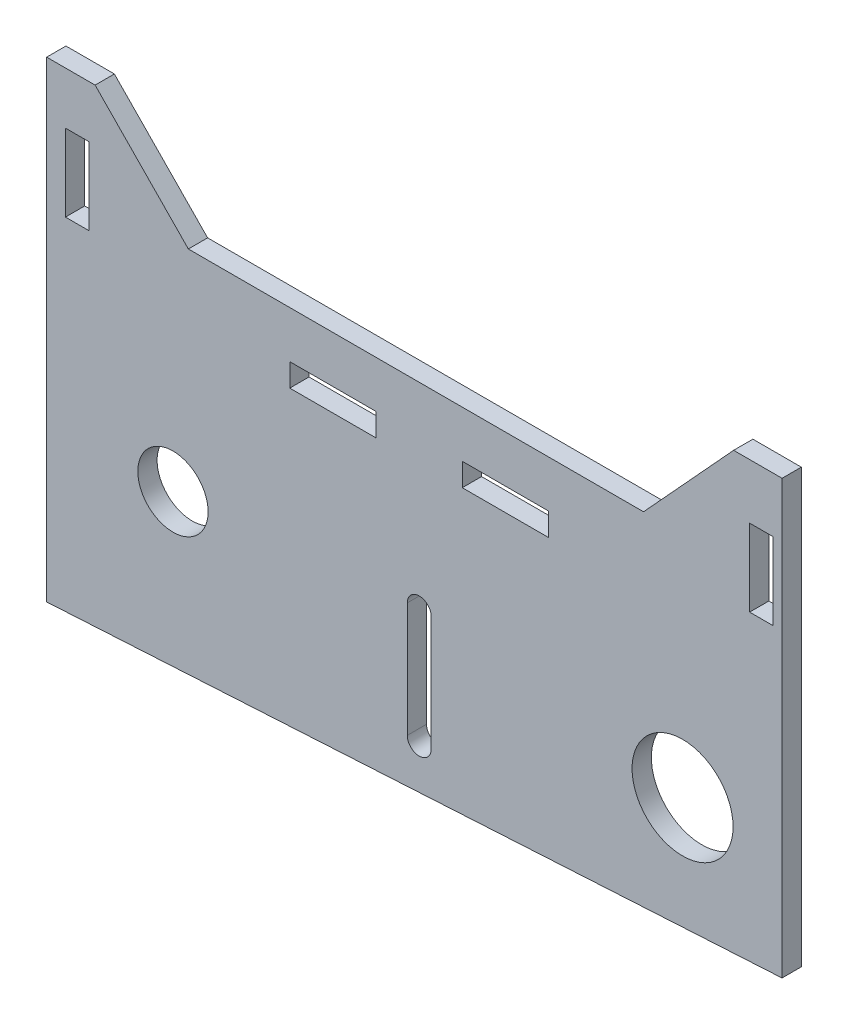
ISO-10303-21;
HEADER;
FILE_DESCRIPTION(('STEP AP214'),'2;1');
FILE_NAME('part.step','',(''),(''),'','','');
FILE_SCHEMA(('AUTOMOTIVE_DESIGN { 1 0 10303 214 1 1 1 1 }'));
ENDSEC;
DATA;
#1=APPLICATION_CONTEXT('core data for automotive mechanical design processes');
#2=APPLICATION_PROTOCOL_DEFINITION('international standard','automotive_design',2000,#1);
#3=PRODUCT_CONTEXT('',#1,'mechanical');
#4=PRODUCT('Part','Part','',(#3));
#5=PRODUCT_RELATED_PRODUCT_CATEGORY('part','',(#4));
#6=PRODUCT_DEFINITION_FORMATION('','',#4);
#7=PRODUCT_DEFINITION_CONTEXT('part definition',#1,'design');
#8=PRODUCT_DEFINITION('design','',#6,#7);
#9=PRODUCT_DEFINITION_SHAPE('','',#8);
#10=(LENGTH_UNIT() NAMED_UNIT(*) SI_UNIT(.MILLI.,.METRE.));
#11=(NAMED_UNIT(*) PLANE_ANGLE_UNIT() SI_UNIT($,.RADIAN.));
#12=(NAMED_UNIT(*) SI_UNIT($,.STERADIAN.) SOLID_ANGLE_UNIT());
#13=UNCERTAINTY_MEASURE_WITH_UNIT(LENGTH_MEASURE(1.E-05),#10,'distance_accuracy_value','');
#14=(GEOMETRIC_REPRESENTATION_CONTEXT(3) GLOBAL_UNCERTAINTY_ASSIGNED_CONTEXT((#13)) GLOBAL_UNIT_ASSIGNED_CONTEXT((#10,
#11,#12)) REPRESENTATION_CONTEXT('',''));
#15=CARTESIAN_POINT('',(0.,0.,0.));
#16=DIRECTION('',(0.,0.,1.));
#17=DIRECTION('',(1.,0.,0.));
#18=AXIS2_PLACEMENT_3D('',#15,#16,#17);
#19=CARTESIAN_POINT('',(0.,0.,3.7));
#20=DIRECTION('',(0.,0.,-1.));
#21=DIRECTION('',(-1.,0.,0.));
#22=AXIS2_PLACEMENT_3D('',#19,#20,#21);
#23=PLANE('',#22);
#24=DIRECTION('',(0.,-1.,0.));
#25=VECTOR('',#24,1.);
#26=CARTESIAN_POINT('',(-19.7334198475014,21.4267015706806,3.7));
#27=LINE('',#26,#25);
#28=CARTESIAN_POINT('',(-19.7334198475014,25.8267015706806,3.7));
#29=VERTEX_POINT('',#28);
#30=CARTESIAN_POINT('',(-19.7334198475014,21.4267015706806,3.7));
#31=VERTEX_POINT('',#30);
#32=EDGE_CURVE('E261',#29,#31,#27,.T.);
#33=ORIENTED_EDGE('',*,*,#32,.F.);
#34=DIRECTION('',(-1.,0.,0.));
#35=VECTOR('',#34,1.);
#36=CARTESIAN_POINT('',(-19.7334198475014,25.8267015706806,3.7));
#37=LINE('',#36,#35);
#38=CARTESIAN_POINT('',(-3.13341984750139,25.8267015706806,3.7));
#39=VERTEX_POINT('',#38);
#40=EDGE_CURVE('E269',#39,#29,#37,.T.);
#41=ORIENTED_EDGE('',*,*,#40,.F.);
#42=DIRECTION('',(0.,1.,0.));
#43=VECTOR('',#42,1.);
#44=CARTESIAN_POINT('',(-3.13341984750139,21.4267015706806,3.7));
#45=LINE('',#44,#43);
#46=CARTESIAN_POINT('',(-3.13341984750139,21.4267015706806,3.7));
#47=VERTEX_POINT('',#46);
#48=EDGE_CURVE('E266',#47,#39,#45,.T.);
#49=ORIENTED_EDGE('',*,*,#48,.F.);
#50=DIRECTION('',(1.,0.,0.));
#51=VECTOR('',#50,1.);
#52=CARTESIAN_POINT('',(-19.7334198475014,21.4267015706806,3.7));
#53=LINE('',#52,#51);
#54=EDGE_CURVE('E263',#31,#47,#53,.T.);
#55=ORIENTED_EDGE('',*,*,#54,.F.);
#56=EDGE_LOOP('',(#33,#41,#49,#55));
#57=FACE_BOUND('',#56,.T.);
#58=DIRECTION('',(0.,1.,0.));
#59=VECTOR('',#58,1.);
#60=CARTESIAN_POINT('',(73.0654198742534,28.3267015706806,3.7));
#61=LINE('',#60,#59);
#62=CARTESIAN_POINT('',(73.0654198742534,28.3267015706806,3.7));
#63=VERTEX_POINT('',#62);
#64=CARTESIAN_POINT('',(73.0654198742534,43.1267015706806,3.7));
#65=VERTEX_POINT('',#64);
#66=EDGE_CURVE('E323',#63,#65,#61,.T.);
#67=ORIENTED_EDGE('',*,*,#66,.F.);
#68=DIRECTION('',(1.,0.,0.));
#69=VECTOR('',#68,1.);
#70=CARTESIAN_POINT('',(73.0654198742534,28.3267015706806,3.7));
#71=LINE('',#70,#69);
#72=CARTESIAN_POINT('',(68.5654198742534,28.3267015706806,3.7));
#73=VERTEX_POINT('',#72);
#74=EDGE_CURVE('E331',#73,#63,#71,.T.);
#75=ORIENTED_EDGE('',*,*,#74,.F.);
#76=DIRECTION('',(0.,-1.,0.));
#77=VECTOR('',#76,1.);
#78=CARTESIAN_POINT('',(68.5654198742534,28.3267015706806,3.7));
#79=LINE('',#78,#77);
#80=CARTESIAN_POINT('',(68.5654198742534,43.1267015706806,3.7));
#81=VERTEX_POINT('',#80);
#82=EDGE_CURVE('E328',#81,#73,#79,.T.);
#83=ORIENTED_EDGE('',*,*,#82,.F.);
#84=DIRECTION('',(-1.,0.,0.));
#85=VECTOR('',#84,1.);
#86=CARTESIAN_POINT('',(73.0654198742534,43.1267015706806,3.7));
#87=LINE('',#86,#85);
#88=EDGE_CURVE('E325',#65,#81,#87,.T.);
#89=ORIENTED_EDGE('',*,*,#88,.F.);
#90=EDGE_LOOP('',(#67,#75,#83,#89));
#91=FACE_BOUND('',#90,.T.);
#92=DIRECTION('',(0.998369758639099,0.0570773600905516,0.));
#93=VECTOR('',#92,1.);
#94=CARTESIAN_POINT('',(-66.4083769633508,-37.4732984293194,3.7));
#95=LINE('',#94,#93);
#96=CARTESIAN_POINT('',(-66.4083769633508,-37.4732984293194,3.7));
#97=VERTEX_POINT('',#96);
#98=CARTESIAN_POINT('',(74.7904627584041,-29.400881422065,3.7));
#99=VERTEX_POINT('',#98);
#100=EDGE_CURVE('E385',#97,#99,#95,.T.);
#101=ORIENTED_EDGE('',*,*,#100,.T.);
#102=DIRECTION('',(0.,1.,0.));
#103=VECTOR('',#102,1.);
#104=CARTESIAN_POINT('',(74.790462758404,53.699118577935,3.7));
#105=LINE('',#104,#103);
#106=CARTESIAN_POINT('',(74.790462758404,53.699118577935,3.7));
#107=VERTEX_POINT('',#106);
#108=EDGE_CURVE('E388',#99,#107,#105,.T.);
#109=ORIENTED_EDGE('',*,*,#108,.T.);
#110=DIRECTION('',(-1.,0.,0.));
#111=VECTOR('',#110,1.);
#112=CARTESIAN_POINT('',(65.490462758404,53.699118577935,3.7));
#113=LINE('',#112,#111);
#114=CARTESIAN_POINT('',(65.490462758404,53.699118577935,3.7));
#115=VERTEX_POINT('',#114);
#116=EDGE_CURVE('E391',#107,#115,#113,.T.);
#117=ORIENTED_EDGE('',*,*,#116,.T.);
#118=DIRECTION('',(-0.675670461818545,-0.737203789345873,0.));
#119=VECTOR('',#118,1.);
#120=CARTESIAN_POINT('',(48.1932989358493,34.8267015706806,3.7));
#121=LINE('',#120,#119);
#122=CARTESIAN_POINT('',(48.1932989358493,34.8267015706806,3.7));
#123=VERTEX_POINT('',#122);
#124=EDGE_CURVE('E393',#115,#123,#121,.T.);
#125=ORIENTED_EDGE('',*,*,#124,.T.);
#126=DIRECTION('',(-1.,0.,0.));
#127=VECTOR('',#126,1.);
#128=CARTESIAN_POINT('',(-39.2067010641507,34.8267015706806,3.7));
#129=LINE('',#128,#127);
#130=CARTESIAN_POINT('',(-39.2067010641507,34.8267015706806,3.7));
#131=VERTEX_POINT('',#130);
#132=EDGE_CURVE('E395',#123,#131,#129,.T.);
#133=ORIENTED_EDGE('',*,*,#132,.T.);
#134=DIRECTION('',(-0.699284214812502,0.71484375,0.));
#135=VECTOR('',#134,1.);
#136=CARTESIAN_POINT('',(-57.1083769633508,53.1267015706806,3.7));
#137=LINE('',#136,#135);
#138=CARTESIAN_POINT('',(-57.1083769633508,53.1267015706806,3.7));
#139=VERTEX_POINT('',#138);
#140=EDGE_CURVE('E397',#131,#139,#137,.T.);
#141=ORIENTED_EDGE('',*,*,#140,.T.);
#142=DIRECTION('',(-1.,0.,0.));
#143=VECTOR('',#142,1.);
#144=CARTESIAN_POINT('',(-66.4083769633508,53.1267015706806,3.7));
#145=LINE('',#144,#143);
#146=CARTESIAN_POINT('',(-66.4083769633508,53.1267015706806,3.7));
#147=VERTEX_POINT('',#146);
#148=EDGE_CURVE('E399',#139,#147,#145,.T.);
#149=ORIENTED_EDGE('',*,*,#148,.T.);
#150=DIRECTION('',(0.,-1.,0.));
#151=VECTOR('',#150,1.);
#152=CARTESIAN_POINT('',(-66.4083769633508,-37.4732984293194,3.7));
#153=LINE('',#152,#151);
#154=EDGE_CURVE('E401',#147,#97,#153,.T.);
#155=ORIENTED_EDGE('',*,*,#154,.T.);
#156=EDGE_LOOP('',(#101,#109,#117,#125,#133,#141,#149,#155));
#157=FACE_BOUND('',#156,.T.);
#158=DIRECTION('',(0.,1.,0.));
#159=VECTOR('',#158,1.);
#160=CARTESIAN_POINT('',(-58.3083769633508,28.3267015706806,3.7));
#161=LINE('',#160,#159);
#162=CARTESIAN_POINT('',(-58.3083769633508,28.3267015706806,3.7));
#163=VERTEX_POINT('',#162);
#164=CARTESIAN_POINT('',(-58.3083769633508,43.1267015706806,3.7));
#165=VERTEX_POINT('',#164);
#166=EDGE_CURVE('E354',#163,#165,#161,.T.);
#167=ORIENTED_EDGE('',*,*,#166,.F.);
#168=DIRECTION('',(1.,0.,0.));
#169=VECTOR('',#168,1.);
#170=CARTESIAN_POINT('',(-62.8083769633508,28.3267015706806,3.7));
#171=LINE('',#170,#169);
#172=CARTESIAN_POINT('',(-62.8083769633508,28.3267015706806,3.7));
#173=VERTEX_POINT('',#172);
#174=EDGE_CURVE('E362',#173,#163,#171,.T.);
#175=ORIENTED_EDGE('',*,*,#174,.F.);
#176=DIRECTION('',(0.,-1.,0.));
#177=VECTOR('',#176,1.);
#178=CARTESIAN_POINT('',(-62.8083769633508,28.3267015706806,3.7));
#179=LINE('',#178,#177);
#180=CARTESIAN_POINT('',(-62.8083769633508,43.1267015706806,3.7));
#181=VERTEX_POINT('',#180);
#182=EDGE_CURVE('E359',#181,#173,#179,.T.);
#183=ORIENTED_EDGE('',*,*,#182,.F.);
#184=DIRECTION('',(-1.,0.,0.));
#185=VECTOR('',#184,1.);
#186=CARTESIAN_POINT('',(-62.8083769633508,43.1267015706806,3.7));
#187=LINE('',#186,#185);
#188=EDGE_CURVE('E356',#165,#181,#187,.T.);
#189=ORIENTED_EDGE('',*,*,#188,.F.);
#190=EDGE_LOOP('',(#167,#175,#183,#189));
#191=FACE_BOUND('',#190,.T.);
#192=DIRECTION('',(0.,-1.,0.));
#193=VECTOR('',#192,1.);
#194=CARTESIAN_POINT('',(13.390462758404,21.4267015706806,3.7));
#195=LINE('',#194,#193);
#196=CARTESIAN_POINT('',(13.390462758404,25.8267015706806,3.7));
#197=VERTEX_POINT('',#196);
#198=CARTESIAN_POINT('',(13.390462758404,21.4267015706806,3.7));
#199=VERTEX_POINT('',#198);
#200=EDGE_CURVE('E292',#197,#199,#195,.T.);
#201=ORIENTED_EDGE('',*,*,#200,.F.);
#202=DIRECTION('',(-1.,0.,0.));
#203=VECTOR('',#202,1.);
#204=CARTESIAN_POINT('',(29.990462758404,25.8267015706806,3.7));
#205=LINE('',#204,#203);
#206=CARTESIAN_POINT('',(29.990462758404,25.8267015706806,3.7));
#207=VERTEX_POINT('',#206);
#208=EDGE_CURVE('E300',#207,#197,#205,.T.);
#209=ORIENTED_EDGE('',*,*,#208,.F.);
#210=DIRECTION('',(0.,1.,0.));
#211=VECTOR('',#210,1.);
#212=CARTESIAN_POINT('',(29.990462758404,21.4267015706806,3.7));
#213=LINE('',#212,#211);
#214=CARTESIAN_POINT('',(29.990462758404,21.4267015706806,3.7));
#215=VERTEX_POINT('',#214);
#216=EDGE_CURVE('E297',#215,#207,#213,.T.);
#217=ORIENTED_EDGE('',*,*,#216,.F.);
#218=DIRECTION('',(1.,0.,0.));
#219=VECTOR('',#218,1.);
#220=CARTESIAN_POINT('',(29.990462758404,21.4267015706806,3.7));
#221=LINE('',#220,#219);
#222=EDGE_CURVE('E294',#199,#215,#221,.T.);
#223=ORIENTED_EDGE('',*,*,#222,.F.);
#224=EDGE_LOOP('',(#201,#209,#217,#223));
#225=FACE_BOUND('',#224,.T.);
#226=CARTESIAN_POINT('',(5.12852145545133,-3.00186740609012,3.7));
#227=DIRECTION('',(0.,0.,1.));
#228=DIRECTION('',(1.,0.,0.));
#229=AXIS2_PLACEMENT_3D('',#226,#227,#228);
#230=CIRCLE('',#229,2.3);
#231=CARTESIAN_POINT('',(7.42852145545133,-3.00186740609012,3.7));
#232=VERTEX_POINT('',#231);
#233=CARTESIAN_POINT('',(2.82852145545133,-3.00186740609012,3.7));
#234=VERTEX_POINT('',#233);
#235=EDGE_CURVE('E222',#232,#234,#230,.T.);
#236=ORIENTED_EDGE('',*,*,#235,.F.);
#237=DIRECTION('',(0.,1.,0.));
#238=VECTOR('',#237,1.);
#239=CARTESIAN_POINT('',(7.42852145545133,-3.00186740609012,3.7));
#240=LINE('',#239,#238);
#241=CARTESIAN_POINT('',(7.42852145545133,-25.0370899256922,3.7));
#242=VERTEX_POINT('',#241);
#243=EDGE_CURVE('E245',#242,#232,#240,.T.);
#244=ORIENTED_EDGE('',*,*,#243,.F.);
#245=CARTESIAN_POINT('',(5.12852145545133,-25.0370899256922,3.7));
#246=DIRECTION('',(0.,0.,1.));
#247=DIRECTION('',(1.,0.,0.));
#248=AXIS2_PLACEMENT_3D('',#245,#246,#247);
#249=CIRCLE('',#248,2.3);
#250=CARTESIAN_POINT('',(2.82852145545133,-25.0370899256922,3.7));
#251=VERTEX_POINT('',#250);
#252=EDGE_CURVE('E243',#251,#242,#249,.T.);
#253=ORIENTED_EDGE('',*,*,#252,.F.);
#254=DIRECTION('',(0.,-1.,0.));
#255=VECTOR('',#254,1.);
#256=CARTESIAN_POINT('',(2.82852145545133,-3.00186740609012,3.7));
#257=LINE('',#256,#255);
#258=EDGE_CURVE('E230',#234,#251,#257,.T.);
#259=ORIENTED_EDGE('',*,*,#258,.F.);
#260=EDGE_LOOP('',(#236,#244,#253,#259));
#261=FACE_BOUND('',#260,.T.);
#262=CARTESIAN_POINT('',(55.690462758404,-8.95773173162212,3.7));
#263=DIRECTION('',(0.,0.,1.));
#264=DIRECTION('',(1.,0.,0.));
#265=AXIS2_PLACEMENT_3D('',#262,#263,#264);
#266=CIRCLE('',#265,9.7);
#267=CARTESIAN_POINT('',(65.390462758404,-8.95773173162212,3.7));
#268=VERTEX_POINT('',#267);
#269=EDGE_CURVE('E251',#268,#268,#266,.T.);
#270=ORIENTED_EDGE('',*,*,#269,.F.);
#271=EDGE_LOOP('',(#270));
#272=FACE_BOUND('',#271,.T.);
#273=CARTESIAN_POINT('',(-42.1583769633508,-6.98947645971031,3.7));
#274=DIRECTION('',(0.,0.,1.));
#275=DIRECTION('',(1.,0.,0.));
#276=AXIS2_PLACEMENT_3D('',#273,#274,#275);
#277=CIRCLE('',#276,6.75);
#278=CARTESIAN_POINT('',(-35.4083769633508,-6.98947645971031,3.7));
#279=VERTEX_POINT('',#278);
#280=EDGE_CURVE('E718',#279,#279,#277,.T.);
#281=ORIENTED_EDGE('',*,*,#280,.F.);
#282=EDGE_LOOP('',(#281));
#283=FACE_BOUND('',#282,.T.);
#284=ADVANCED_FACE('F37',(#57,#91,#157,#191,#225,#261,#272,#283),#23,.F.);
#285=CARTESIAN_POINT('',(0.,0.,0.));
#286=DIRECTION('',(0.,0.,-1.));
#287=DIRECTION('',(-1.,0.,0.));
#288=AXIS2_PLACEMENT_3D('',#285,#286,#287);
#289=PLANE('',#288);
#290=CARTESIAN_POINT('',(55.690462758404,-8.95773173162212,0.));
#291=DIRECTION('',(0.,0.,1.));
#292=DIRECTION('',(1.,0.,0.));
#293=AXIS2_PLACEMENT_3D('',#290,#291,#292);
#294=CIRCLE('',#293,9.7);
#295=CARTESIAN_POINT('',(65.390462758404,-8.95773173162212,0.));
#296=VERTEX_POINT('',#295);
#297=EDGE_CURVE('E724',#296,#296,#294,.T.);
#298=ORIENTED_EDGE('',*,*,#297,.T.);
#299=EDGE_LOOP('',(#298));
#300=FACE_BOUND('',#299,.T.);
#301=DIRECTION('',(0.998369758639099,0.0570773600905516,0.));
#302=VECTOR('',#301,1.);
#303=CARTESIAN_POINT('',(-66.4083769633508,-37.4732984293194,0.));
#304=LINE('',#303,#302);
#305=CARTESIAN_POINT('',(-66.4083769633508,-37.4732984293194,0.));
#306=VERTEX_POINT('',#305);
#307=CARTESIAN_POINT('',(74.7904627584041,-29.400881422065,0.));
#308=VERTEX_POINT('',#307);
#309=EDGE_CURVE('E384',#306,#308,#304,.T.);
#310=ORIENTED_EDGE('',*,*,#309,.F.);
#311=DIRECTION('',(0.,-1.,0.));
#312=VECTOR('',#311,1.);
#313=CARTESIAN_POINT('',(-66.4083769633508,-37.4732984293194,0.));
#314=LINE('',#313,#312);
#315=CARTESIAN_POINT('',(-66.4083769633508,53.1267015706806,0.));
#316=VERTEX_POINT('',#315);
#317=EDGE_CURVE('E389',#316,#306,#314,.T.);
#318=ORIENTED_EDGE('',*,*,#317,.F.);
#319=DIRECTION('',(-1.,0.,0.));
#320=VECTOR('',#319,1.);
#321=CARTESIAN_POINT('',(-66.4083769633508,53.1267015706806,0.));
#322=LINE('',#321,#320);
#323=CARTESIAN_POINT('',(-57.1083769633508,53.1267015706806,0.));
#324=VERTEX_POINT('',#323);
#325=EDGE_CURVE('E416',#324,#316,#322,.T.);
#326=ORIENTED_EDGE('',*,*,#325,.F.);
#327=DIRECTION('',(-0.699284214812502,0.71484375,0.));
#328=VECTOR('',#327,1.);
#329=CARTESIAN_POINT('',(-57.1083769633508,53.1267015706806,0.));
#330=LINE('',#329,#328);
#331=CARTESIAN_POINT('',(-39.2067010641507,34.8267015706806,0.));
#332=VERTEX_POINT('',#331);
#333=EDGE_CURVE('E414',#332,#324,#330,.T.);
#334=ORIENTED_EDGE('',*,*,#333,.F.);
#335=DIRECTION('',(-1.,0.,0.));
#336=VECTOR('',#335,1.);
#337=CARTESIAN_POINT('',(-39.2067010641507,34.8267015706806,0.));
#338=LINE('',#337,#336);
#339=CARTESIAN_POINT('',(48.1932989358493,34.8267015706806,0.));
#340=VERTEX_POINT('',#339);
#341=EDGE_CURVE('E412',#340,#332,#338,.T.);
#342=ORIENTED_EDGE('',*,*,#341,.F.);
#343=DIRECTION('',(-0.675670461818545,-0.737203789345873,0.));
#344=VECTOR('',#343,1.);
#345=CARTESIAN_POINT('',(48.1932989358493,34.8267015706806,0.));
#346=LINE('',#345,#344);
#347=CARTESIAN_POINT('',(65.490462758404,53.699118577935,0.));
#348=VERTEX_POINT('',#347);
#349=EDGE_CURVE('E410',#348,#340,#346,.T.);
#350=ORIENTED_EDGE('',*,*,#349,.F.);
#351=DIRECTION('',(-1.,0.,0.));
#352=VECTOR('',#351,1.);
#353=CARTESIAN_POINT('',(65.490462758404,53.699118577935,0.));
#354=LINE('',#353,#352);
#355=CARTESIAN_POINT('',(74.790462758404,53.699118577935,0.));
#356=VERTEX_POINT('',#355);
#357=EDGE_CURVE('E408',#356,#348,#354,.T.);
#358=ORIENTED_EDGE('',*,*,#357,.F.);
#359=DIRECTION('',(0.,1.,0.));
#360=VECTOR('',#359,1.);
#361=CARTESIAN_POINT('',(74.790462758404,53.699118577935,0.));
#362=LINE('',#361,#360);
#363=EDGE_CURVE('E406',#308,#356,#362,.T.);
#364=ORIENTED_EDGE('',*,*,#363,.F.);
#365=EDGE_LOOP('',(#310,#318,#326,#334,#342,#350,#358,#364));
#366=FACE_BOUND('',#365,.T.);
#367=DIRECTION('',(1.,0.,0.));
#368=VECTOR('',#367,1.);
#369=CARTESIAN_POINT('',(-62.8083769633508,28.3267015706806,0.));
#370=LINE('',#369,#368);
#371=CARTESIAN_POINT('',(-62.8083769633508,28.3267015706806,0.));
#372=VERTEX_POINT('',#371);
#373=CARTESIAN_POINT('',(-58.3083769633508,28.3267015706806,0.));
#374=VERTEX_POINT('',#373);
#375=EDGE_CURVE('E357',#372,#374,#370,.T.);
#376=ORIENTED_EDGE('',*,*,#375,.T.);
#377=DIRECTION('',(0.,1.,0.));
#378=VECTOR('',#377,1.);
#379=CARTESIAN_POINT('',(-58.3083769633508,28.3267015706806,0.));
#380=LINE('',#379,#378);
#381=CARTESIAN_POINT('',(-58.3083769633508,43.1267015706806,0.));
#382=VERTEX_POINT('',#381);
#383=EDGE_CURVE('E353',#374,#382,#380,.T.);
#384=ORIENTED_EDGE('',*,*,#383,.T.);
#385=DIRECTION('',(-1.,0.,0.));
#386=VECTOR('',#385,1.);
#387=CARTESIAN_POINT('',(-62.8083769633508,43.1267015706806,0.));
#388=LINE('',#387,#386);
#389=CARTESIAN_POINT('',(-62.8083769633508,43.1267015706806,0.));
#390=VERTEX_POINT('',#389);
#391=EDGE_CURVE('E367',#382,#390,#388,.T.);
#392=ORIENTED_EDGE('',*,*,#391,.T.);
#393=DIRECTION('',(0.,-1.,0.));
#394=VECTOR('',#393,1.);
#395=CARTESIAN_POINT('',(-62.8083769633508,28.3267015706806,0.));
#396=LINE('',#395,#394);
#397=EDGE_CURVE('E370',#390,#372,#396,.T.);
#398=ORIENTED_EDGE('',*,*,#397,.T.);
#399=EDGE_LOOP('',(#376,#384,#392,#398));
#400=FACE_BOUND('',#399,.T.);
#401=DIRECTION('',(1.,0.,0.));
#402=VECTOR('',#401,1.);
#403=CARTESIAN_POINT('',(73.0654198742534,28.3267015706806,0.));
#404=LINE('',#403,#402);
#405=CARTESIAN_POINT('',(68.5654198742534,28.3267015706806,0.));
#406=VERTEX_POINT('',#405);
#407=CARTESIAN_POINT('',(73.0654198742534,28.3267015706806,0.));
#408=VERTEX_POINT('',#407);
#409=EDGE_CURVE('E326',#406,#408,#404,.T.);
#410=ORIENTED_EDGE('',*,*,#409,.T.);
#411=DIRECTION('',(0.,1.,0.));
#412=VECTOR('',#411,1.);
#413=CARTESIAN_POINT('',(73.0654198742534,28.3267015706806,0.));
#414=LINE('',#413,#412);
#415=CARTESIAN_POINT('',(73.0654198742534,43.1267015706806,0.));
#416=VERTEX_POINT('',#415);
#417=EDGE_CURVE('E322',#408,#416,#414,.T.);
#418=ORIENTED_EDGE('',*,*,#417,.T.);
#419=DIRECTION('',(-1.,0.,0.));
#420=VECTOR('',#419,1.);
#421=CARTESIAN_POINT('',(73.0654198742534,43.1267015706806,0.));
#422=LINE('',#421,#420);
#423=CARTESIAN_POINT('',(68.5654198742534,43.1267015706806,0.));
#424=VERTEX_POINT('',#423);
#425=EDGE_CURVE('E336',#416,#424,#422,.T.);
#426=ORIENTED_EDGE('',*,*,#425,.T.);
#427=DIRECTION('',(0.,-1.,0.));
#428=VECTOR('',#427,1.);
#429=CARTESIAN_POINT('',(68.5654198742534,28.3267015706806,0.));
#430=LINE('',#429,#428);
#431=EDGE_CURVE('E339',#424,#406,#430,.T.);
#432=ORIENTED_EDGE('',*,*,#431,.T.);
#433=EDGE_LOOP('',(#410,#418,#426,#432));
#434=FACE_BOUND('',#433,.T.);
#435=DIRECTION('',(-1.,0.,0.));
#436=VECTOR('',#435,1.);
#437=CARTESIAN_POINT('',(29.990462758404,25.8267015706806,0.));
#438=LINE('',#437,#436);
#439=CARTESIAN_POINT('',(29.990462758404,25.8267015706806,0.));
#440=VERTEX_POINT('',#439);
#441=CARTESIAN_POINT('',(13.390462758404,25.8267015706806,0.));
#442=VERTEX_POINT('',#441);
#443=EDGE_CURVE('E295',#440,#442,#438,.T.);
#444=ORIENTED_EDGE('',*,*,#443,.T.);
#445=DIRECTION('',(0.,-1.,0.));
#446=VECTOR('',#445,1.);
#447=CARTESIAN_POINT('',(13.390462758404,21.4267015706806,0.));
#448=LINE('',#447,#446);
#449=CARTESIAN_POINT('',(13.390462758404,21.4267015706806,0.));
#450=VERTEX_POINT('',#449);
#451=EDGE_CURVE('E291',#442,#450,#448,.T.);
#452=ORIENTED_EDGE('',*,*,#451,.T.);
#453=DIRECTION('',(1.,0.,0.));
#454=VECTOR('',#453,1.);
#455=CARTESIAN_POINT('',(29.990462758404,21.4267015706806,0.));
#456=LINE('',#455,#454);
#457=CARTESIAN_POINT('',(29.990462758404,21.4267015706806,0.));
#458=VERTEX_POINT('',#457);
#459=EDGE_CURVE('E305',#450,#458,#456,.T.);
#460=ORIENTED_EDGE('',*,*,#459,.T.);
#461=DIRECTION('',(0.,1.,0.));
#462=VECTOR('',#461,1.);
#463=CARTESIAN_POINT('',(29.990462758404,21.4267015706806,0.));
#464=LINE('',#463,#462);
#465=EDGE_CURVE('E308',#458,#440,#464,.T.);
#466=ORIENTED_EDGE('',*,*,#465,.T.);
#467=EDGE_LOOP('',(#444,#452,#460,#466));
#468=FACE_BOUND('',#467,.T.);
#469=DIRECTION('',(-1.,0.,0.));
#470=VECTOR('',#469,1.);
#471=CARTESIAN_POINT('',(-19.7334198475014,25.8267015706806,0.));
#472=LINE('',#471,#470);
#473=CARTESIAN_POINT('',(-3.13341984750139,25.8267015706806,0.));
#474=VERTEX_POINT('',#473);
#475=CARTESIAN_POINT('',(-19.7334198475014,25.8267015706806,0.));
#476=VERTEX_POINT('',#475);
#477=EDGE_CURVE('E264',#474,#476,#472,.T.);
#478=ORIENTED_EDGE('',*,*,#477,.T.);
#479=DIRECTION('',(0.,-1.,0.));
#480=VECTOR('',#479,1.);
#481=CARTESIAN_POINT('',(-19.7334198475014,21.4267015706806,0.));
#482=LINE('',#481,#480);
#483=CARTESIAN_POINT('',(-19.7334198475014,21.4267015706806,0.));
#484=VERTEX_POINT('',#483);
#485=EDGE_CURVE('E238',#476,#484,#482,.T.);
#486=ORIENTED_EDGE('',*,*,#485,.T.);
#487=DIRECTION('',(1.,0.,0.));
#488=VECTOR('',#487,1.);
#489=CARTESIAN_POINT('',(-19.7334198475014,21.4267015706806,0.));
#490=LINE('',#489,#488);
#491=CARTESIAN_POINT('',(-3.13341984750139,21.4267015706806,0.));
#492=VERTEX_POINT('',#491);
#493=EDGE_CURVE('E274',#484,#492,#490,.T.);
#494=ORIENTED_EDGE('',*,*,#493,.T.);
#495=DIRECTION('',(0.,1.,0.));
#496=VECTOR('',#495,1.);
#497=CARTESIAN_POINT('',(-3.13341984750139,21.4267015706806,0.));
#498=LINE('',#497,#496);
#499=EDGE_CURVE('E277',#492,#474,#498,.T.);
#500=ORIENTED_EDGE('',*,*,#499,.T.);
#501=EDGE_LOOP('',(#478,#486,#494,#500));
#502=FACE_BOUND('',#501,.T.);
#503=DIRECTION('',(0.,1.,0.));
#504=VECTOR('',#503,1.);
#505=CARTESIAN_POINT('',(7.42852145545133,-3.00186740609012,0.));
#506=LINE('',#505,#504);
#507=CARTESIAN_POINT('',(7.42852145545133,-25.0370899256922,0.));
#508=VERTEX_POINT('',#507);
#509=CARTESIAN_POINT('',(7.42852145545133,-3.00186740609012,0.));
#510=VERTEX_POINT('',#509);
#511=EDGE_CURVE('E231',#508,#510,#506,.T.);
#512=ORIENTED_EDGE('',*,*,#511,.T.);
#513=CARTESIAN_POINT('',(5.12852145545133,-3.00186740609012,0.));
#514=DIRECTION('',(0.,0.,1.));
#515=DIRECTION('',(1.,0.,0.));
#516=AXIS2_PLACEMENT_3D('',#513,#514,#515);
#517=CIRCLE('',#516,2.3);
#518=CARTESIAN_POINT('',(2.82852145545133,-3.00186740609012,0.));
#519=VERTEX_POINT('',#518);
#520=EDGE_CURVE('E60',#510,#519,#517,.T.);
#521=ORIENTED_EDGE('',*,*,#520,.T.);
#522=DIRECTION('',(0.,-1.,0.));
#523=VECTOR('',#522,1.);
#524=CARTESIAN_POINT('',(2.82852145545133,-3.00186740609012,0.));
#525=LINE('',#524,#523);
#526=CARTESIAN_POINT('',(2.82852145545133,-25.0370899256922,0.));
#527=VERTEX_POINT('',#526);
#528=EDGE_CURVE('E237',#519,#527,#525,.T.);
#529=ORIENTED_EDGE('',*,*,#528,.T.);
#530=CARTESIAN_POINT('',(5.12852145545133,-25.0370899256922,0.));
#531=DIRECTION('',(0.,0.,1.));
#532=DIRECTION('',(1.,0.,0.));
#533=AXIS2_PLACEMENT_3D('',#530,#531,#532);
#534=CIRCLE('',#533,2.3);
#535=EDGE_CURVE('E253',#527,#508,#534,.T.);
#536=ORIENTED_EDGE('',*,*,#535,.T.);
#537=EDGE_LOOP('',(#512,#521,#529,#536));
#538=FACE_BOUND('',#537,.T.);
#539=CARTESIAN_POINT('',(-42.1583769633508,-6.98947645971031,0.));
#540=DIRECTION('',(0.,0.,1.));
#541=DIRECTION('',(1.,0.,0.));
#542=AXIS2_PLACEMENT_3D('',#539,#540,#541);
#543=CIRCLE('',#542,6.75);
#544=CARTESIAN_POINT('',(-35.4083769633508,-6.98947645971031,0.));
#545=VERTEX_POINT('',#544);
#546=EDGE_CURVE('E721',#545,#545,#543,.T.);
#547=ORIENTED_EDGE('',*,*,#546,.T.);
#548=EDGE_LOOP('',(#547));
#549=FACE_BOUND('',#548,.T.);
#550=ADVANCED_FACE('F446',(#300,#366,#400,#434,#468,#502,#538,#549),#289,.T.);
#551=CARTESIAN_POINT('',(-66.4083769633508,-37.4732984293194,3.7));
#552=DIRECTION('',(-0.0570773600905516,0.998369758639099,0.));
#553=DIRECTION('',(-0.998369758639099,-0.0570773600905516,0.));
#554=AXIS2_PLACEMENT_3D('',#551,#552,#553);
#555=PLANE('',#554);
#556=ORIENTED_EDGE('',*,*,#309,.T.);
#557=DIRECTION('',(0.,0.,-1.));
#558=VECTOR('',#557,1.);
#559=CARTESIAN_POINT('',(74.7904627584041,-29.400881422065,3.7));
#560=LINE('',#559,#558);
#561=EDGE_CURVE('E11',#99,#308,#560,.T.);
#562=ORIENTED_EDGE('',*,*,#561,.F.);
#563=ORIENTED_EDGE('',*,*,#100,.F.);
#564=DIRECTION('',(0.,0.,-1.));
#565=VECTOR('',#564,1.);
#566=CARTESIAN_POINT('',(-66.4083769633508,-37.4732984293194,3.7));
#567=LINE('',#566,#565);
#568=EDGE_CURVE('E403',#97,#306,#567,.T.);
#569=ORIENTED_EDGE('',*,*,#568,.T.);
#570=EDGE_LOOP('',(#556,#562,#563,#569));
#571=FACE_BOUND('',#570,.T.);
#572=ADVANCED_FACE('F39',(#571),#555,.F.);
#573=CARTESIAN_POINT('',(74.790462758404,53.699118577935,3.7));
#574=DIRECTION('',(-1.,0.,0.));
#575=DIRECTION('',(0.,-1.,0.));
#576=AXIS2_PLACEMENT_3D('',#573,#574,#575);
#577=PLANE('',#576);
#578=ORIENTED_EDGE('',*,*,#363,.T.);
#579=DIRECTION('',(0.,0.,-1.));
#580=VECTOR('',#579,1.);
#581=CARTESIAN_POINT('',(74.790462758404,53.699118577935,3.7));
#582=LINE('',#581,#580);
#583=EDGE_CURVE('E45',#107,#356,#582,.T.);
#584=ORIENTED_EDGE('',*,*,#583,.F.);
#585=ORIENTED_EDGE('',*,*,#108,.F.);
#586=ORIENTED_EDGE('',*,*,#561,.T.);
#587=EDGE_LOOP('',(#578,#584,#585,#586));
#588=FACE_BOUND('',#587,.T.);
#589=ADVANCED_FACE('F464',(#588),#577,.F.);
#590=CARTESIAN_POINT('',(65.490462758404,53.699118577935,3.7));
#591=DIRECTION('',(0.,-1.,0.));
#592=DIRECTION('',(0.,0.,-1.));
#593=AXIS2_PLACEMENT_3D('',#590,#591,#592);
#594=PLANE('',#593);
#595=ORIENTED_EDGE('',*,*,#357,.T.);
#596=DIRECTION('',(0.,0.,-1.));
#597=VECTOR('',#596,1.);
#598=CARTESIAN_POINT('',(65.490462758404,53.699118577935,3.7));
#599=LINE('',#598,#597);
#600=EDGE_CURVE('E433',#115,#348,#599,.T.);
#601=ORIENTED_EDGE('',*,*,#600,.F.);
#602=ORIENTED_EDGE('',*,*,#116,.F.);
#603=ORIENTED_EDGE('',*,*,#583,.T.);
#604=EDGE_LOOP('',(#595,#601,#602,#603));
#605=FACE_BOUND('',#604,.T.);
#606=ADVANCED_FACE('F440',(#605),#594,.F.);
#607=CARTESIAN_POINT('',(48.1932989358493,34.8267015706806,3.7));
#608=DIRECTION('',(0.737203789345873,-0.675670461818545,0.));
#609=DIRECTION('',(0.675670461818545,0.737203789345873,0.));
#610=AXIS2_PLACEMENT_3D('',#607,#608,#609);
#611=PLANE('',#610);
#612=ORIENTED_EDGE('',*,*,#349,.T.);
#613=DIRECTION('',(0.,0.,-1.));
#614=VECTOR('',#613,1.);
#615=CARTESIAN_POINT('',(48.1932989358493,34.8267015706806,3.7));
#616=LINE('',#615,#614);
#617=EDGE_CURVE('E430',#123,#340,#616,.T.);
#618=ORIENTED_EDGE('',*,*,#617,.F.);
#619=ORIENTED_EDGE('',*,*,#124,.F.);
#620=ORIENTED_EDGE('',*,*,#600,.T.);
#621=EDGE_LOOP('',(#612,#618,#619,#620));
#622=FACE_BOUND('',#621,.T.);
#623=ADVANCED_FACE('F452',(#622),#611,.F.);
#624=CARTESIAN_POINT('',(-39.2067010641507,34.8267015706806,3.7));
#625=DIRECTION('',(0.,-1.,0.));
#626=DIRECTION('',(1.,0.,0.));
#627=AXIS2_PLACEMENT_3D('',#624,#625,#626);
#628=PLANE('',#627);
#629=ORIENTED_EDGE('',*,*,#341,.T.);
#630=DIRECTION('',(0.,0.,-1.));
#631=VECTOR('',#630,1.);
#632=CARTESIAN_POINT('',(-39.2067010641507,34.8267015706806,3.7));
#633=LINE('',#632,#631);
#634=EDGE_CURVE('E427',#131,#332,#633,.T.);
#635=ORIENTED_EDGE('',*,*,#634,.F.);
#636=ORIENTED_EDGE('',*,*,#132,.F.);
#637=ORIENTED_EDGE('',*,*,#617,.T.);
#638=EDGE_LOOP('',(#629,#635,#636,#637));
#639=FACE_BOUND('',#638,.T.);
#640=ADVANCED_FACE('F456',(#639),#628,.F.);
#641=CARTESIAN_POINT('',(-57.1083769633508,53.1267015706806,3.7));
#642=DIRECTION('',(-0.71484375,-0.699284214812502,0.));
#643=DIRECTION('',(0.699284214812502,-0.71484375,0.));
#644=AXIS2_PLACEMENT_3D('',#641,#642,#643);
#645=PLANE('',#644);
#646=ORIENTED_EDGE('',*,*,#333,.T.);
#647=DIRECTION('',(0.,0.,-1.));
#648=VECTOR('',#647,1.);
#649=CARTESIAN_POINT('',(-57.1083769633508,53.1267015706806,3.7));
#650=LINE('',#649,#648);
#651=EDGE_CURVE('E424',#139,#324,#650,.T.);
#652=ORIENTED_EDGE('',*,*,#651,.F.);
#653=ORIENTED_EDGE('',*,*,#140,.F.);
#654=ORIENTED_EDGE('',*,*,#634,.T.);
#655=EDGE_LOOP('',(#646,#652,#653,#654));
#656=FACE_BOUND('',#655,.T.);
#657=ADVANCED_FACE('F477',(#656),#645,.F.);
#658=CARTESIAN_POINT('',(-66.4083769633508,53.1267015706806,3.7));
#659=DIRECTION('',(0.,-1.,0.));
#660=DIRECTION('',(0.,0.,-1.));
#661=AXIS2_PLACEMENT_3D('',#658,#659,#660);
#662=PLANE('',#661);
#663=ORIENTED_EDGE('',*,*,#325,.T.);
#664=DIRECTION('',(0.,0.,-1.));
#665=VECTOR('',#664,1.);
#666=CARTESIAN_POINT('',(-66.4083769633508,53.1267015706806,3.7));
#667=LINE('',#666,#665);
#668=EDGE_CURVE('E421',#147,#316,#667,.T.);
#669=ORIENTED_EDGE('',*,*,#668,.F.);
#670=ORIENTED_EDGE('',*,*,#148,.F.);
#671=ORIENTED_EDGE('',*,*,#651,.T.);
#672=EDGE_LOOP('',(#663,#669,#670,#671));
#673=FACE_BOUND('',#672,.T.);
#674=ADVANCED_FACE('F475',(#673),#662,.F.);
#675=CARTESIAN_POINT('',(-66.4083769633508,-37.4732984293194,3.7));
#676=DIRECTION('',(1.,0.,0.));
#677=DIRECTION('',(0.,0.,-1.));
#678=AXIS2_PLACEMENT_3D('',#675,#676,#677);
#679=PLANE('',#678);
#680=ORIENTED_EDGE('',*,*,#317,.T.);
#681=ORIENTED_EDGE('',*,*,#568,.F.);
#682=ORIENTED_EDGE('',*,*,#154,.F.);
#683=ORIENTED_EDGE('',*,*,#668,.T.);
#684=EDGE_LOOP('',(#680,#681,#682,#683));
#685=FACE_BOUND('',#684,.T.);
#686=ADVANCED_FACE('F470',(#685),#679,.F.);
#687=CARTESIAN_POINT('',(-58.3083769633508,28.3267015706806,3.7));
#688=DIRECTION('',(-1.,0.,0.));
#689=DIRECTION('',(0.,0.,1.));
#690=AXIS2_PLACEMENT_3D('',#687,#688,#689);
#691=PLANE('',#690);
#692=ORIENTED_EDGE('',*,*,#383,.F.);
#693=DIRECTION('',(0.,0.,-1.));
#694=VECTOR('',#693,1.);
#695=CARTESIAN_POINT('',(-58.3083769633508,28.3267015706806,3.7));
#696=LINE('',#695,#694);
#697=EDGE_CURVE('E364',#163,#374,#696,.T.);
#698=ORIENTED_EDGE('',*,*,#697,.F.);
#699=ORIENTED_EDGE('',*,*,#166,.T.);
#700=DIRECTION('',(0.,0.,-1.));
#701=VECTOR('',#700,1.);
#702=CARTESIAN_POINT('',(-58.3083769633508,43.1267015706806,3.7));
#703=LINE('',#702,#701);
#704=EDGE_CURVE('E381',#165,#382,#703,.T.);
#705=ORIENTED_EDGE('',*,*,#704,.T.);
#706=EDGE_LOOP('',(#692,#698,#699,#705));
#707=FACE_BOUND('',#706,.T.);
#708=ADVANCED_FACE('F497',(#707),#691,.T.);
#709=CARTESIAN_POINT('',(-62.8083769633508,43.1267015706806,3.7));
#710=DIRECTION('',(0.,-1.,0.));
#711=DIRECTION('',(0.,0.,-1.));
#712=AXIS2_PLACEMENT_3D('',#709,#710,#711);
#713=PLANE('',#712);
#714=ORIENTED_EDGE('',*,*,#391,.F.);
#715=ORIENTED_EDGE('',*,*,#704,.F.);
#716=ORIENTED_EDGE('',*,*,#188,.T.);
#717=DIRECTION('',(0.,0.,-1.));
#718=VECTOR('',#717,1.);
#719=CARTESIAN_POINT('',(-62.8083769633508,43.1267015706806,3.7));
#720=LINE('',#719,#718);
#721=EDGE_CURVE('E379',#181,#390,#720,.T.);
#722=ORIENTED_EDGE('',*,*,#721,.T.);
#723=EDGE_LOOP('',(#714,#715,#716,#722));
#724=FACE_BOUND('',#723,.T.);
#725=ADVANCED_FACE('F504',(#724),#713,.T.);
#726=CARTESIAN_POINT('',(-62.8083769633508,28.3267015706806,3.7));
#727=DIRECTION('',(1.,0.,0.));
#728=DIRECTION('',(0.,0.,-1.));
#729=AXIS2_PLACEMENT_3D('',#726,#727,#728);
#730=PLANE('',#729);
#731=ORIENTED_EDGE('',*,*,#397,.F.);
#732=ORIENTED_EDGE('',*,*,#721,.F.);
#733=ORIENTED_EDGE('',*,*,#182,.T.);
#734=DIRECTION('',(0.,0.,-1.));
#735=VECTOR('',#734,1.);
#736=CARTESIAN_POINT('',(-62.8083769633508,28.3267015706806,3.7));
#737=LINE('',#736,#735);
#738=EDGE_CURVE('E377',#173,#372,#737,.T.);
#739=ORIENTED_EDGE('',*,*,#738,.T.);
#740=EDGE_LOOP('',(#731,#732,#733,#739));
#741=FACE_BOUND('',#740,.T.);
#742=ADVANCED_FACE('F509',(#741),#730,.T.);
#743=CARTESIAN_POINT('',(-62.8083769633508,28.3267015706806,3.7));
#744=DIRECTION('',(0.,1.,0.));
#745=DIRECTION('',(0.,0.,1.));
#746=AXIS2_PLACEMENT_3D('',#743,#744,#745);
#747=PLANE('',#746);
#748=ORIENTED_EDGE('',*,*,#375,.F.);
#749=ORIENTED_EDGE('',*,*,#738,.F.);
#750=ORIENTED_EDGE('',*,*,#174,.T.);
#751=ORIENTED_EDGE('',*,*,#697,.T.);
#752=EDGE_LOOP('',(#748,#749,#750,#751));
#753=FACE_BOUND('',#752,.T.);
#754=ADVANCED_FACE('F516',(#753),#747,.T.);
#755=CARTESIAN_POINT('',(73.0654198742534,28.3267015706806,3.7));
#756=DIRECTION('',(-1.,0.,0.));
#757=DIRECTION('',(0.,0.,1.));
#758=AXIS2_PLACEMENT_3D('',#755,#756,#757);
#759=PLANE('',#758);
#760=ORIENTED_EDGE('',*,*,#417,.F.);
#761=DIRECTION('',(0.,0.,-1.));
#762=VECTOR('',#761,1.);
#763=CARTESIAN_POINT('',(73.0654198742534,28.3267015706806,3.7));
#764=LINE('',#763,#762);
#765=EDGE_CURVE('E333',#63,#408,#764,.T.);
#766=ORIENTED_EDGE('',*,*,#765,.F.);
#767=ORIENTED_EDGE('',*,*,#66,.T.);
#768=DIRECTION('',(0.,0.,-1.));
#769=VECTOR('',#768,1.);
#770=CARTESIAN_POINT('',(73.0654198742534,43.1267015706806,3.7));
#771=LINE('',#770,#769);
#772=EDGE_CURVE('E350',#65,#416,#771,.T.);
#773=ORIENTED_EDGE('',*,*,#772,.T.);
#774=EDGE_LOOP('',(#760,#766,#767,#773));
#775=FACE_BOUND('',#774,.T.);
#776=ADVANCED_FACE('F568',(#775),#759,.T.);
#777=CARTESIAN_POINT('',(73.0654198742534,43.1267015706806,3.7));
#778=DIRECTION('',(0.,-1.,0.));
#779=DIRECTION('',(0.,0.,-1.));
#780=AXIS2_PLACEMENT_3D('',#777,#778,#779);
#781=PLANE('',#780);
#782=ORIENTED_EDGE('',*,*,#425,.F.);
#783=ORIENTED_EDGE('',*,*,#772,.F.);
#784=ORIENTED_EDGE('',*,*,#88,.T.);
#785=DIRECTION('',(0.,0.,-1.));
#786=VECTOR('',#785,1.);
#787=CARTESIAN_POINT('',(68.5654198742534,43.1267015706806,3.7));
#788=LINE('',#787,#786);
#789=EDGE_CURVE('E348',#81,#424,#788,.T.);
#790=ORIENTED_EDGE('',*,*,#789,.T.);
#791=EDGE_LOOP('',(#782,#783,#784,#790));
#792=FACE_BOUND('',#791,.T.);
#793=ADVANCED_FACE('F564',(#792),#781,.T.);
#794=CARTESIAN_POINT('',(68.5654198742534,28.3267015706806,3.7));
#795=DIRECTION('',(1.,0.,0.));
#796=DIRECTION('',(0.,0.,-1.));
#797=AXIS2_PLACEMENT_3D('',#794,#795,#796);
#798=PLANE('',#797);
#799=ORIENTED_EDGE('',*,*,#431,.F.);
#800=ORIENTED_EDGE('',*,*,#789,.F.);
#801=ORIENTED_EDGE('',*,*,#82,.T.);
#802=DIRECTION('',(0.,0.,-1.));
#803=VECTOR('',#802,1.);
#804=CARTESIAN_POINT('',(68.5654198742534,28.3267015706806,3.7));
#805=LINE('',#804,#803);
#806=EDGE_CURVE('E346',#73,#406,#805,.T.);
#807=ORIENTED_EDGE('',*,*,#806,.T.);
#808=EDGE_LOOP('',(#799,#800,#801,#807));
#809=FACE_BOUND('',#808,.T.);
#810=ADVANCED_FACE('F560',(#809),#798,.T.);
#811=CARTESIAN_POINT('',(73.0654198742534,28.3267015706806,3.7));
#812=DIRECTION('',(0.,1.,0.));
#813=DIRECTION('',(-1.,0.,0.));
#814=AXIS2_PLACEMENT_3D('',#811,#812,#813);
#815=PLANE('',#814);
#816=ORIENTED_EDGE('',*,*,#409,.F.);
#817=ORIENTED_EDGE('',*,*,#806,.F.);
#818=ORIENTED_EDGE('',*,*,#74,.T.);
#819=ORIENTED_EDGE('',*,*,#765,.T.);
#820=EDGE_LOOP('',(#816,#817,#818,#819));
#821=FACE_BOUND('',#820,.T.);
#822=ADVANCED_FACE('F557',(#821),#815,.T.);
#823=CARTESIAN_POINT('',(13.390462758404,21.4267015706806,3.7));
#824=DIRECTION('',(1.,0.,0.));
#825=DIRECTION('',(0.,0.,-1.));
#826=AXIS2_PLACEMENT_3D('',#823,#824,#825);
#827=PLANE('',#826);
#828=ORIENTED_EDGE('',*,*,#451,.F.);
#829=DIRECTION('',(0.,0.,-1.));
#830=VECTOR('',#829,1.);
#831=CARTESIAN_POINT('',(13.390462758404,25.8267015706806,3.7));
#832=LINE('',#831,#830);
#833=EDGE_CURVE('E302',#197,#442,#832,.T.);
#834=ORIENTED_EDGE('',*,*,#833,.F.);
#835=ORIENTED_EDGE('',*,*,#200,.T.);
#836=DIRECTION('',(0.,0.,-1.));
#837=VECTOR('',#836,1.);
#838=CARTESIAN_POINT('',(13.390462758404,21.4267015706806,3.7));
#839=LINE('',#838,#837);
#840=EDGE_CURVE('E319',#199,#450,#839,.T.);
#841=ORIENTED_EDGE('',*,*,#840,.T.);
#842=EDGE_LOOP('',(#828,#834,#835,#841));
#843=FACE_BOUND('',#842,.T.);
#844=ADVANCED_FACE('F532',(#843),#827,.T.);
#845=CARTESIAN_POINT('',(29.990462758404,21.4267015706806,3.7));
#846=DIRECTION('',(0.,1.,0.));
#847=DIRECTION('',(-1.,0.,0.));
#848=AXIS2_PLACEMENT_3D('',#845,#846,#847);
#849=PLANE('',#848);
#850=ORIENTED_EDGE('',*,*,#459,.F.);
#851=ORIENTED_EDGE('',*,*,#840,.F.);
#852=ORIENTED_EDGE('',*,*,#222,.T.);
#853=DIRECTION('',(0.,0.,-1.));
#854=VECTOR('',#853,1.);
#855=CARTESIAN_POINT('',(29.990462758404,21.4267015706806,3.7));
#856=LINE('',#855,#854);
#857=EDGE_CURVE('E317',#215,#458,#856,.T.);
#858=ORIENTED_EDGE('',*,*,#857,.T.);
#859=EDGE_LOOP('',(#850,#851,#852,#858));
#860=FACE_BOUND('',#859,.T.);
#861=ADVANCED_FACE('F534',(#860),#849,.T.);
#862=CARTESIAN_POINT('',(29.990462758404,21.4267015706806,3.7));
#863=DIRECTION('',(-1.,0.,0.));
#864=DIRECTION('',(0.,-1.,0.));
#865=AXIS2_PLACEMENT_3D('',#862,#863,#864);
#866=PLANE('',#865);
#867=ORIENTED_EDGE('',*,*,#465,.F.);
#868=ORIENTED_EDGE('',*,*,#857,.F.);
#869=ORIENTED_EDGE('',*,*,#216,.T.);
#870=DIRECTION('',(0.,0.,-1.));
#871=VECTOR('',#870,1.);
#872=CARTESIAN_POINT('',(29.990462758404,25.8267015706806,3.7));
#873=LINE('',#872,#871);
#874=EDGE_CURVE('E315',#207,#440,#873,.T.);
#875=ORIENTED_EDGE('',*,*,#874,.T.);
#876=EDGE_LOOP('',(#867,#868,#869,#875));
#877=FACE_BOUND('',#876,.T.);
#878=ADVANCED_FACE('F543',(#877),#866,.T.);
#879=CARTESIAN_POINT('',(29.990462758404,25.8267015706806,3.7));
#880=DIRECTION('',(0.,-1.,0.));
#881=DIRECTION('',(0.,0.,-1.));
#882=AXIS2_PLACEMENT_3D('',#879,#880,#881);
#883=PLANE('',#882);
#884=ORIENTED_EDGE('',*,*,#443,.F.);
#885=ORIENTED_EDGE('',*,*,#874,.F.);
#886=ORIENTED_EDGE('',*,*,#208,.T.);
#887=ORIENTED_EDGE('',*,*,#833,.T.);
#888=EDGE_LOOP('',(#884,#885,#886,#887));
#889=FACE_BOUND('',#888,.T.);
#890=ADVANCED_FACE('F541',(#889),#883,.T.);
#891=CARTESIAN_POINT('',(-19.7334198475014,21.4267015706806,3.7));
#892=DIRECTION('',(1.,0.,0.));
#893=DIRECTION('',(0.,1.,0.));
#894=AXIS2_PLACEMENT_3D('',#891,#892,#893);
#895=PLANE('',#894);
#896=ORIENTED_EDGE('',*,*,#485,.F.);
#897=DIRECTION('',(0.,0.,-1.));
#898=VECTOR('',#897,1.);
#899=CARTESIAN_POINT('',(-19.7334198475014,25.8267015706806,3.7));
#900=LINE('',#899,#898);
#901=EDGE_CURVE('E271',#29,#476,#900,.T.);
#902=ORIENTED_EDGE('',*,*,#901,.F.);
#903=ORIENTED_EDGE('',*,*,#32,.T.);
#904=DIRECTION('',(0.,0.,-1.));
#905=VECTOR('',#904,1.);
#906=CARTESIAN_POINT('',(-19.7334198475014,21.4267015706806,3.7));
#907=LINE('',#906,#905);
#908=EDGE_CURVE('E288',#31,#484,#907,.T.);
#909=ORIENTED_EDGE('',*,*,#908,.T.);
#910=EDGE_LOOP('',(#896,#902,#903,#909));
#911=FACE_BOUND('',#910,.T.);
#912=ADVANCED_FACE('F550',(#911),#895,.T.);
#913=CARTESIAN_POINT('',(-19.7334198475014,21.4267015706806,3.7));
#914=DIRECTION('',(0.,1.,0.));
#915=DIRECTION('',(0.,0.,1.));
#916=AXIS2_PLACEMENT_3D('',#913,#914,#915);
#917=PLANE('',#916);
#918=ORIENTED_EDGE('',*,*,#493,.F.);
#919=ORIENTED_EDGE('',*,*,#908,.F.);
#920=ORIENTED_EDGE('',*,*,#54,.T.);
#921=DIRECTION('',(0.,0.,-1.));
#922=VECTOR('',#921,1.);
#923=CARTESIAN_POINT('',(-3.13341984750139,21.4267015706806,3.7));
#924=LINE('',#923,#922);
#925=EDGE_CURVE('E286',#47,#492,#924,.T.);
#926=ORIENTED_EDGE('',*,*,#925,.T.);
#927=EDGE_LOOP('',(#918,#919,#920,#926));
#928=FACE_BOUND('',#927,.T.);
#929=ADVANCED_FACE('F627',(#928),#917,.T.);
#930=CARTESIAN_POINT('',(-3.13341984750139,21.4267015706806,3.7));
#931=DIRECTION('',(-1.,0.,0.));
#932=DIRECTION('',(0.,0.,1.));
#933=AXIS2_PLACEMENT_3D('',#930,#931,#932);
#934=PLANE('',#933);
#935=ORIENTED_EDGE('',*,*,#499,.F.);
#936=ORIENTED_EDGE('',*,*,#925,.F.);
#937=ORIENTED_EDGE('',*,*,#48,.T.);
#938=DIRECTION('',(0.,0.,-1.));
#939=VECTOR('',#938,1.);
#940=CARTESIAN_POINT('',(-3.13341984750139,25.8267015706806,3.7));
#941=LINE('',#940,#939);
#942=EDGE_CURVE('E284',#39,#474,#941,.T.);
#943=ORIENTED_EDGE('',*,*,#942,.T.);
#944=EDGE_LOOP('',(#935,#936,#937,#943));
#945=FACE_BOUND('',#944,.T.);
#946=ADVANCED_FACE('F636',(#945),#934,.T.);
#947=CARTESIAN_POINT('',(-19.7334198475014,25.8267015706806,3.7));
#948=DIRECTION('',(0.,-1.,0.));
#949=DIRECTION('',(1.,0.,0.));
#950=AXIS2_PLACEMENT_3D('',#947,#948,#949);
#951=PLANE('',#950);
#952=ORIENTED_EDGE('',*,*,#477,.F.);
#953=ORIENTED_EDGE('',*,*,#942,.F.);
#954=ORIENTED_EDGE('',*,*,#40,.T.);
#955=ORIENTED_EDGE('',*,*,#901,.T.);
#956=EDGE_LOOP('',(#952,#953,#954,#955));
#957=FACE_BOUND('',#956,.T.);
#958=ADVANCED_FACE('F646',(#957),#951,.T.);
#959=CARTESIAN_POINT('',(5.12852145545133,-3.00186740609012,3.7));
#960=DIRECTION('',(0.,0.,-1.));
#961=DIRECTION('',(-1.,0.,0.));
#962=AXIS2_PLACEMENT_3D('',#959,#960,#961);
#963=CYLINDRICAL_SURFACE('',#962,2.3);
#964=ORIENTED_EDGE('',*,*,#520,.F.);
#965=DIRECTION('',(0.,0.,-1.));
#966=VECTOR('',#965,1.);
#967=CARTESIAN_POINT('',(7.42852145545133,-3.00186740609012,3.7));
#968=LINE('',#967,#966);
#969=EDGE_CURVE('E226',#232,#510,#968,.T.);
#970=ORIENTED_EDGE('',*,*,#969,.F.);
#971=ORIENTED_EDGE('',*,*,#235,.T.);
#972=DIRECTION('',(0.,0.,-1.));
#973=VECTOR('',#972,1.);
#974=CARTESIAN_POINT('',(2.82852145545133,-3.00186740609012,3.7));
#975=LINE('',#974,#973);
#976=EDGE_CURVE('E225',#234,#519,#975,.T.);
#977=ORIENTED_EDGE('',*,*,#976,.T.);
#978=EDGE_LOOP('',(#964,#970,#971,#977));
#979=FACE_BOUND('',#978,.T.);
#980=ADVANCED_FACE('F224',(#979),#963,.F.);
#981=CARTESIAN_POINT('',(2.82852145545133,-3.00186740609012,3.7));
#982=DIRECTION('',(1.,0.,0.));
#983=DIRECTION('',(0.,1.,0.));
#984=AXIS2_PLACEMENT_3D('',#981,#982,#983);
#985=PLANE('',#984);
#986=ORIENTED_EDGE('',*,*,#528,.F.);
#987=ORIENTED_EDGE('',*,*,#976,.F.);
#988=ORIENTED_EDGE('',*,*,#258,.T.);
#989=DIRECTION('',(0.,0.,-1.));
#990=VECTOR('',#989,1.);
#991=CARTESIAN_POINT('',(2.82852145545133,-25.0370899256922,3.7));
#992=LINE('',#991,#990);
#993=EDGE_CURVE('E239',#251,#527,#992,.T.);
#994=ORIENTED_EDGE('',*,*,#993,.T.);
#995=EDGE_LOOP('',(#986,#987,#988,#994));
#996=FACE_BOUND('',#995,.T.);
#997=ADVANCED_FACE('F234',(#996),#985,.T.);
#998=CARTESIAN_POINT('',(5.12852145545133,-25.0370899256922,3.7));
#999=DIRECTION('',(0.,0.,-1.));
#1000=DIRECTION('',(-1.,0.,0.));
#1001=AXIS2_PLACEMENT_3D('',#998,#999,#1000);
#1002=CYLINDRICAL_SURFACE('',#1001,2.3);
#1003=ORIENTED_EDGE('',*,*,#535,.F.);
#1004=ORIENTED_EDGE('',*,*,#993,.F.);
#1005=ORIENTED_EDGE('',*,*,#252,.T.);
#1006=DIRECTION('',(0.,0.,-1.));
#1007=VECTOR('',#1006,1.);
#1008=CARTESIAN_POINT('',(7.42852145545133,-25.0370899256922,3.7));
#1009=LINE('',#1008,#1007);
#1010=EDGE_CURVE('E52',#242,#508,#1009,.T.);
#1011=ORIENTED_EDGE('',*,*,#1010,.T.);
#1012=EDGE_LOOP('',(#1003,#1004,#1005,#1011));
#1013=FACE_BOUND('',#1012,.T.);
#1014=ADVANCED_FACE('F673',(#1013),#1002,.F.);
#1015=CARTESIAN_POINT('',(7.42852145545133,-3.00186740609012,3.7));
#1016=DIRECTION('',(-1.,0.,0.));
#1017=DIRECTION('',(0.,-1.,0.));
#1018=AXIS2_PLACEMENT_3D('',#1015,#1016,#1017);
#1019=PLANE('',#1018);
#1020=ORIENTED_EDGE('',*,*,#511,.F.);
#1021=ORIENTED_EDGE('',*,*,#1010,.F.);
#1022=ORIENTED_EDGE('',*,*,#243,.T.);
#1023=ORIENTED_EDGE('',*,*,#969,.T.);
#1024=EDGE_LOOP('',(#1020,#1021,#1022,#1023));
#1025=FACE_BOUND('',#1024,.T.);
#1026=ADVANCED_FACE('F682',(#1025),#1019,.T.);
#1027=CARTESIAN_POINT('',(55.690462758404,-8.95773173162212,3.7));
#1028=DIRECTION('',(0.,0.,-1.));
#1029=DIRECTION('',(-1.,0.,0.));
#1030=AXIS2_PLACEMENT_3D('',#1027,#1028,#1029);
#1031=CYLINDRICAL_SURFACE('',#1030,9.7);
#1032=ORIENTED_EDGE('',*,*,#269,.T.);
#1033=EDGE_LOOP('',(#1032));
#1034=FACE_BOUND('',#1033,.T.);
#1035=ORIENTED_EDGE('',*,*,#297,.F.);
#1036=EDGE_LOOP('',(#1035));
#1037=FACE_BOUND('',#1036,.T.);
#1038=ADVANCED_FACE('F692',(#1034,#1037),#1031,.F.);
#1039=CARTESIAN_POINT('',(-42.1583769633508,-6.98947645971031,3.7));
#1040=DIRECTION('',(0.,0.,-1.));
#1041=DIRECTION('',(-1.,0.,0.));
#1042=AXIS2_PLACEMENT_3D('',#1039,#1040,#1041);
#1043=CYLINDRICAL_SURFACE('',#1042,6.75);
#1044=ORIENTED_EDGE('',*,*,#280,.T.);
#1045=EDGE_LOOP('',(#1044));
#1046=FACE_BOUND('',#1045,.T.);
#1047=ORIENTED_EDGE('',*,*,#546,.F.);
#1048=EDGE_LOOP('',(#1047));
#1049=FACE_BOUND('',#1048,.T.);
#1050=ADVANCED_FACE('F701',(#1046,#1049),#1043,.F.);
#1051=CLOSED_SHELL('',(#284,#550,#572,#589,#606,#623,#640,#657,#674,#686,#708,#725,#742,#754,
#776,#793,#810,#822,#844,#861,#878,#890,#912,#929,#946,#958,#980,#997,#1014,#1026,#1038,#1050));
#1052=MANIFOLD_SOLID_BREP('B2',#1051);
#1053=ADVANCED_BREP_SHAPE_REPRESENTATION('',(#18,#1052),#14);
#1054=SHAPE_DEFINITION_REPRESENTATION(#9,#1053);
ENDSEC;
END-ISO-10303-21;
